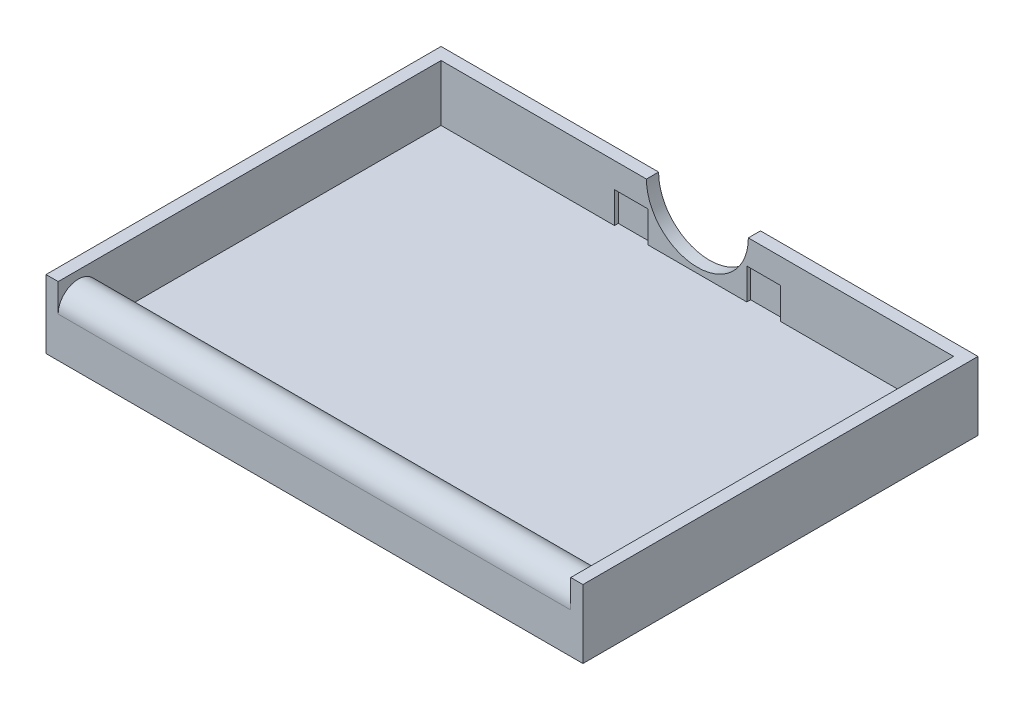
ISO-10303-21;
HEADER;
FILE_DESCRIPTION(('STEP AP214'),'2;1');
FILE_NAME('part.step','',(''),(''),'','','');
FILE_SCHEMA(('AUTOMOTIVE_DESIGN { 1 0 10303 214 1 1 1 1 }'));
ENDSEC;
DATA;
#1=APPLICATION_CONTEXT('core data for automotive mechanical design processes');
#2=APPLICATION_PROTOCOL_DEFINITION('international standard','automotive_design',2000,#1);
#3=PRODUCT_CONTEXT('',#1,'mechanical');
#4=PRODUCT('Part','Part','',(#3));
#5=PRODUCT_RELATED_PRODUCT_CATEGORY('part','',(#4));
#6=PRODUCT_DEFINITION_FORMATION('','',#4);
#7=PRODUCT_DEFINITION_CONTEXT('part definition',#1,'design');
#8=PRODUCT_DEFINITION('design','',#6,#7);
#9=PRODUCT_DEFINITION_SHAPE('','',#8);
#10=(LENGTH_UNIT() NAMED_UNIT(*) SI_UNIT(.MILLI.,.METRE.));
#11=(NAMED_UNIT(*) PLANE_ANGLE_UNIT() SI_UNIT($,.RADIAN.));
#12=(NAMED_UNIT(*) SI_UNIT($,.STERADIAN.) SOLID_ANGLE_UNIT());
#13=UNCERTAINTY_MEASURE_WITH_UNIT(LENGTH_MEASURE(1.E-05),#10,'distance_accuracy_value','');
#14=(GEOMETRIC_REPRESENTATION_CONTEXT(3) GLOBAL_UNCERTAINTY_ASSIGNED_CONTEXT((#13)) GLOBAL_UNIT_ASSIGNED_CONTEXT((#10,
#11,#12)) REPRESENTATION_CONTEXT('',''));
#15=CARTESIAN_POINT('',(0.,0.,0.));
#16=DIRECTION('',(0.,0.,1.));
#17=DIRECTION('',(1.,0.,0.));
#18=AXIS2_PLACEMENT_3D('',#15,#16,#17);
#19=CARTESIAN_POINT('',(69.2,4.5,49.1));
#20=DIRECTION('',(-1.,0.,0.));
#21=DIRECTION('',(0.,0.,1.));
#22=AXIS2_PLACEMENT_3D('',#19,#20,#21);
#23=CYLINDRICAL_SURFACE('',#22,2.65);
#24=DIRECTION('',(-1.,0.,0.));
#25=VECTOR('',#24,1.);
#26=CARTESIAN_POINT('',(0.,4.49999999999999,51.75));
#27=LINE('',#26,#25);
#28=CARTESIAN_POINT('',(68.9,4.5,51.75));
#29=VERTEX_POINT('',#28);
#30=CARTESIAN_POINT('',(1.50000000000001,4.49999999999999,51.75));
#31=VERTEX_POINT('',#30);
#32=EDGE_CURVE('E174',#29,#31,#27,.T.);
#33=ORIENTED_EDGE('',*,*,#32,.F.);
#34=CARTESIAN_POINT('',(68.9,4.5,49.1));
#35=DIRECTION('',(-1.,0.,0.));
#36=DIRECTION('',(0.,0.,1.));
#37=AXIS2_PLACEMENT_3D('',#34,#35,#36);
#38=CIRCLE('',#37,2.65);
#39=CARTESIAN_POINT('',(68.9,1.85,49.1));
#40=VERTEX_POINT('',#39);
#41=EDGE_CURVE('E52',#40,#29,#38,.F.);
#42=ORIENTED_EDGE('',*,*,#41,.F.);
#43=DIRECTION('',(-1.,0.,0.));
#44=VECTOR('',#43,1.);
#45=CARTESIAN_POINT('',(69.2,1.85,49.1));
#46=LINE('',#45,#44);
#47=CARTESIAN_POINT('',(1.50000000000001,1.85,49.1));
#48=VERTEX_POINT('',#47);
#49=EDGE_CURVE('E11',#40,#48,#46,.T.);
#50=ORIENTED_EDGE('',*,*,#49,.T.);
#51=CARTESIAN_POINT('',(1.50000000000001,4.5,49.1));
#52=DIRECTION('',(1.,0.,0.));
#53=DIRECTION('',(0.,0.,-1.));
#54=AXIS2_PLACEMENT_3D('',#51,#52,#53);
#55=CIRCLE('',#54,2.65);
#56=EDGE_CURVE('E172',#48,#31,#55,.T.);
#57=ORIENTED_EDGE('',*,*,#56,.T.);
#58=EDGE_LOOP('',(#33,#42,#50,#57));
#59=FACE_BOUND('',#58,.T.);
#60=ADVANCED_FACE('F37',(#59),#23,.T.);
#61=CARTESIAN_POINT('',(1.50000000000001,4.5,49.1));
#62=DIRECTION('',(0.,0.,1.));
#63=DIRECTION('',(1.,0.,0.));
#64=AXIS2_PLACEMENT_3D('',#61,#62,#63);
#65=PLANE('',#64);
#66=ORIENTED_EDGE('',*,*,#49,.F.);
#67=DIRECTION('',(0.,-1.,0.));
#68=VECTOR('',#67,1.);
#69=CARTESIAN_POINT('',(68.9,4.5,49.1));
#70=LINE('',#69,#68);
#71=CARTESIAN_POINT('',(68.9,0.8,49.1));
#72=VERTEX_POINT('',#71);
#73=EDGE_CURVE('E214',#40,#72,#70,.T.);
#74=ORIENTED_EDGE('',*,*,#73,.T.);
#75=DIRECTION('',(-1.,0.,0.));
#76=VECTOR('',#75,1.);
#77=CARTESIAN_POINT('',(1.50000000000001,0.8,49.1));
#78=LINE('',#77,#76);
#79=CARTESIAN_POINT('',(1.50000000000001,0.8,49.1));
#80=VERTEX_POINT('',#79);
#81=EDGE_CURVE('E209',#72,#80,#78,.T.);
#82=ORIENTED_EDGE('',*,*,#81,.T.);
#83=DIRECTION('',(0.,-1.,0.));
#84=VECTOR('',#83,1.);
#85=CARTESIAN_POINT('',(1.50000000000001,4.5,49.1));
#86=LINE('',#85,#84);
#87=EDGE_CURVE('E212',#48,#80,#86,.T.);
#88=ORIENTED_EDGE('',*,*,#87,.F.);
#89=EDGE_LOOP('',(#66,#74,#82,#88));
#90=FACE_BOUND('',#89,.T.);
#91=ADVANCED_FACE('F368',(#90),#65,.F.);
#92=CARTESIAN_POINT('',(0.,0.8,0.));
#93=DIRECTION('',(0.,-1.,0.));
#94=DIRECTION('',(0.,0.,-1.));
#95=AXIS2_PLACEMENT_3D('',#92,#93,#94);
#96=PLANE('',#95);
#97=ORIENTED_EDGE('',*,*,#81,.F.);
#98=DIRECTION('',(0.,0.,1.));
#99=VECTOR('',#98,1.);
#100=CARTESIAN_POINT('',(68.9,0.8,1.4));
#101=LINE('',#100,#99);
#102=CARTESIAN_POINT('',(68.9,0.8,1.4));
#103=VERTEX_POINT('',#102);
#104=EDGE_CURVE('E275',#103,#72,#101,.T.);
#105=ORIENTED_EDGE('',*,*,#104,.F.);
#106=DIRECTION('',(1.,0.,0.));
#107=VECTOR('',#106,1.);
#108=CARTESIAN_POINT('',(46.,0.8,1.4));
#109=LINE('',#108,#107);
#110=CARTESIAN_POINT('',(46.1,0.8,1.4));
#111=VERTEX_POINT('',#110);
#112=EDGE_CURVE('E305',#111,#103,#109,.T.);
#113=ORIENTED_EDGE('',*,*,#112,.F.);
#114=DIRECTION('',(0.,0.,1.));
#115=VECTOR('',#114,1.);
#116=CARTESIAN_POINT('',(46.1,0.8,0.9));
#117=LINE('',#116,#115);
#118=CARTESIAN_POINT('',(46.1,0.8,0.9));
#119=VERTEX_POINT('',#118);
#120=EDGE_CURVE('E231',#119,#111,#117,.T.);
#121=ORIENTED_EDGE('',*,*,#120,.F.);
#122=DIRECTION('',(1.,0.,0.));
#123=VECTOR('',#122,1.);
#124=CARTESIAN_POINT('',(41.9,0.8,0.9));
#125=LINE('',#124,#123);
#126=CARTESIAN_POINT('',(41.7,0.8,0.9));
#127=VERTEX_POINT('',#126);
#128=EDGE_CURVE('E292',#127,#119,#125,.T.);
#129=ORIENTED_EDGE('',*,*,#128,.F.);
#130=DIRECTION('',(0.,0.,-1.));
#131=VECTOR('',#130,1.);
#132=CARTESIAN_POINT('',(41.7,0.8,1.4));
#133=LINE('',#132,#131);
#134=CARTESIAN_POINT('',(41.7,0.8,1.4));
#135=VERTEX_POINT('',#134);
#136=EDGE_CURVE('E256',#135,#127,#133,.T.);
#137=ORIENTED_EDGE('',*,*,#136,.F.);
#138=DIRECTION('',(1.,0.,0.));
#139=VECTOR('',#138,1.);
#140=CARTESIAN_POINT('',(28.5,0.8,1.4));
#141=LINE('',#140,#139);
#142=CARTESIAN_POINT('',(28.7,0.8,1.4));
#143=VERTEX_POINT('',#142);
#144=EDGE_CURVE('E301',#143,#135,#141,.T.);
#145=ORIENTED_EDGE('',*,*,#144,.F.);
#146=DIRECTION('',(0.,0.,1.));
#147=VECTOR('',#146,1.);
#148=CARTESIAN_POINT('',(28.7,0.8,0.9));
#149=LINE('',#148,#147);
#150=CARTESIAN_POINT('',(28.7,0.8,0.9));
#151=VERTEX_POINT('',#150);
#152=EDGE_CURVE('E242',#151,#143,#149,.T.);
#153=ORIENTED_EDGE('',*,*,#152,.F.);
#154=DIRECTION('',(1.,0.,0.));
#155=VECTOR('',#154,1.);
#156=CARTESIAN_POINT('',(24.4,0.8,0.9));
#157=LINE('',#156,#155);
#158=CARTESIAN_POINT('',(24.3,0.8,0.9));
#159=VERTEX_POINT('',#158);
#160=EDGE_CURVE('E295',#159,#151,#157,.T.);
#161=ORIENTED_EDGE('',*,*,#160,.F.);
#162=DIRECTION('',(0.,0.,-1.));
#163=VECTOR('',#162,1.);
#164=CARTESIAN_POINT('',(24.3,0.8,1.4));
#165=LINE('',#164,#163);
#166=CARTESIAN_POINT('',(24.3,0.8,1.4));
#167=VERTEX_POINT('',#166);
#168=EDGE_CURVE('E222',#167,#159,#165,.T.);
#169=ORIENTED_EDGE('',*,*,#168,.F.);
#170=DIRECTION('',(1.,0.,0.));
#171=VECTOR('',#170,1.);
#172=CARTESIAN_POINT('',(1.6,0.8,1.4));
#173=LINE('',#172,#171);
#174=CARTESIAN_POINT('',(1.5,0.8,1.4));
#175=VERTEX_POINT('',#174);
#176=EDGE_CURVE('E313',#175,#167,#173,.T.);
#177=ORIENTED_EDGE('',*,*,#176,.F.);
#178=DIRECTION('',(0.,0.,-1.));
#179=VECTOR('',#178,1.);
#180=CARTESIAN_POINT('',(1.50000000000001,0.8,48.4));
#181=LINE('',#180,#179);
#182=EDGE_CURVE('E278',#80,#175,#181,.T.);
#183=ORIENTED_EDGE('',*,*,#182,.F.);
#184=EDGE_LOOP('',(#97,#105,#113,#121,#129,#137,#145,#153,#161,#169,#177,#183));
#185=FACE_BOUND('',#184,.T.);
#186=ADVANCED_FACE('F366',(#185),#96,.F.);
#187=CARTESIAN_POINT('',(1.50000000000001,4.9,48.4));
#188=DIRECTION('',(1.,0.,0.));
#189=DIRECTION('',(0.,0.,-1.));
#190=AXIS2_PLACEMENT_3D('',#187,#188,#189);
#191=PLANE('',#190);
#192=DIRECTION('',(0.,0.,1.));
#193=VECTOR('',#192,1.);
#194=CARTESIAN_POINT('',(1.5,8.2,1.4));
#195=LINE('',#194,#193);
#196=CARTESIAN_POINT('',(1.5,8.2,1.4));
#197=VERTEX_POINT('',#196);
#198=CARTESIAN_POINT('',(1.50000000000001,8.2,51.75));
#199=VERTEX_POINT('',#198);
#200=EDGE_CURVE('E192',#197,#199,#195,.T.);
#201=ORIENTED_EDGE('',*,*,#200,.T.);
#202=DIRECTION('',(0.,1.,0.));
#203=VECTOR('',#202,1.);
#204=CARTESIAN_POINT('',(1.50000000000001,0.,51.75));
#205=LINE('',#204,#203);
#206=EDGE_CURVE('E184',#31,#199,#205,.T.);
#207=ORIENTED_EDGE('',*,*,#206,.F.);
#208=ORIENTED_EDGE('',*,*,#56,.F.);
#209=ORIENTED_EDGE('',*,*,#87,.T.);
#210=ORIENTED_EDGE('',*,*,#182,.T.);
#211=DIRECTION('',(0.,1.,0.));
#212=VECTOR('',#211,1.);
#213=CARTESIAN_POINT('',(1.5,0.8,1.4));
#214=LINE('',#213,#212);
#215=EDGE_CURVE('E280',#175,#197,#214,.T.);
#216=ORIENTED_EDGE('',*,*,#215,.T.);
#217=EDGE_LOOP('',(#201,#207,#208,#209,#210,#216));
#218=FACE_BOUND('',#217,.T.);
#219=ADVANCED_FACE('F189',(#218),#191,.T.);
#220=CARTESIAN_POINT('',(68.9,4.9,48.4));
#221=DIRECTION('',(-1.,0.,0.));
#222=DIRECTION('',(0.,0.,1.));
#223=AXIS2_PLACEMENT_3D('',#220,#221,#222);
#224=PLANE('',#223);
#225=ORIENTED_EDGE('',*,*,#73,.F.);
#226=ORIENTED_EDGE('',*,*,#41,.T.);
#227=DIRECTION('',(0.,-1.,0.));
#228=VECTOR('',#227,1.);
#229=CARTESIAN_POINT('',(68.9,0.,51.75));
#230=LINE('',#229,#228);
#231=CARTESIAN_POINT('',(68.9,8.2,51.75));
#232=VERTEX_POINT('',#231);
#233=EDGE_CURVE('E187',#232,#29,#230,.T.);
#234=ORIENTED_EDGE('',*,*,#233,.F.);
#235=DIRECTION('',(0.,0.,-1.));
#236=VECTOR('',#235,1.);
#237=CARTESIAN_POINT('',(68.9,8.2,50.7));
#238=LINE('',#237,#236);
#239=CARTESIAN_POINT('',(68.9,8.2,1.4));
#240=VERTEX_POINT('',#239);
#241=EDGE_CURVE('E270',#232,#240,#238,.T.);
#242=ORIENTED_EDGE('',*,*,#241,.T.);
#243=DIRECTION('',(0.,-1.,0.));
#244=VECTOR('',#243,1.);
#245=CARTESIAN_POINT('',(68.9,8.2,1.4));
#246=LINE('',#245,#244);
#247=EDGE_CURVE('E272',#240,#103,#246,.T.);
#248=ORIENTED_EDGE('',*,*,#247,.T.);
#249=ORIENTED_EDGE('',*,*,#104,.T.);
#250=EDGE_LOOP('',(#225,#226,#234,#242,#248,#249));
#251=FACE_BOUND('',#250,.T.);
#252=ADVANCED_FACE('F355',(#251),#224,.T.);
#253=CARTESIAN_POINT('',(35.2,8.2,-5.));
#254=DIRECTION('',(0.,0.,1.));
#255=DIRECTION('',(1.,0.,0.));
#256=AXIS2_PLACEMENT_3D('',#253,#254,#255);
#257=CYLINDRICAL_SURFACE('',#256,6.7);
#258=CARTESIAN_POINT('',(35.2,8.2,1.4));
#259=DIRECTION('',(0.,0.,-1.));
#260=DIRECTION('',(1.,0.,0.));
#261=AXIS2_PLACEMENT_3D('',#258,#259,#260);
#262=CIRCLE('',#261,6.7);
#263=CARTESIAN_POINT('',(41.9,8.2,1.4));
#264=VERTEX_POINT('',#263);
#265=CARTESIAN_POINT('',(28.5,8.2,1.4));
#266=VERTEX_POINT('',#265);
#267=EDGE_CURVE('E309',#264,#266,#262,.T.);
#268=ORIENTED_EDGE('',*,*,#267,.F.);
#269=DIRECTION('',(0.,0.,1.));
#270=VECTOR('',#269,1.);
#271=CARTESIAN_POINT('',(41.9,8.2,-5.));
#272=LINE('',#271,#270);
#273=CARTESIAN_POINT('',(41.9,8.2,-0.2));
#274=VERTEX_POINT('',#273);
#275=EDGE_CURVE('E326',#264,#274,#272,.F.);
#276=ORIENTED_EDGE('',*,*,#275,.T.);
#277=CARTESIAN_POINT('',(35.2,8.2,-0.2));
#278=DIRECTION('',(0.,0.,1.));
#279=DIRECTION('',(-1.,0.,0.));
#280=AXIS2_PLACEMENT_3D('',#277,#278,#279);
#281=CIRCLE('',#280,6.7);
#282=CARTESIAN_POINT('',(28.5,8.2,-0.2));
#283=VERTEX_POINT('',#282);
#284=EDGE_CURVE('E319',#283,#274,#281,.T.);
#285=ORIENTED_EDGE('',*,*,#284,.F.);
#286=DIRECTION('',(0.,0.,1.));
#287=VECTOR('',#286,1.);
#288=CARTESIAN_POINT('',(28.5,8.2,-5.));
#289=LINE('',#288,#287);
#290=EDGE_CURVE('E45',#283,#266,#289,.T.);
#291=ORIENTED_EDGE('',*,*,#290,.T.);
#292=EDGE_LOOP('',(#268,#276,#285,#291));
#293=FACE_BOUND('',#292,.T.);
#294=ADVANCED_FACE('F331',(#293),#257,.F.);
#295=CARTESIAN_POINT('',(0.,4.9,1.1));
#296=DIRECTION('',(0.,1.,0.));
#297=DIRECTION('',(-1.,0.,0.));
#298=AXIS2_PLACEMENT_3D('',#295,#296,#297);
#299=PLANE('',#298);
#300=DIRECTION('',(1.,0.,0.));
#301=VECTOR('',#300,1.);
#302=CARTESIAN_POINT('',(24.4,4.9,1.4));
#303=LINE('',#302,#301);
#304=CARTESIAN_POINT('',(24.3,4.9,1.4));
#305=VERTEX_POINT('',#304);
#306=CARTESIAN_POINT('',(28.7,4.9,1.4));
#307=VERTEX_POINT('',#306);
#308=EDGE_CURVE('E297',#305,#307,#303,.T.);
#309=ORIENTED_EDGE('',*,*,#308,.F.);
#310=DIRECTION('',(0.,0.,1.));
#311=VECTOR('',#310,1.);
#312=CARTESIAN_POINT('',(24.3,4.9,0.9));
#313=LINE('',#312,#311);
#314=CARTESIAN_POINT('',(24.3,4.9,0.9));
#315=VERTEX_POINT('',#314);
#316=EDGE_CURVE('E216',#315,#305,#313,.T.);
#317=ORIENTED_EDGE('',*,*,#316,.F.);
#318=DIRECTION('',(-1.,0.,0.));
#319=VECTOR('',#318,1.);
#320=CARTESIAN_POINT('',(28.5,4.9,0.9));
#321=LINE('',#320,#319);
#322=CARTESIAN_POINT('',(28.7,4.9,0.9));
#323=VERTEX_POINT('',#322);
#324=EDGE_CURVE('E291',#323,#315,#321,.T.);
#325=ORIENTED_EDGE('',*,*,#324,.F.);
#326=DIRECTION('',(0.,0.,-1.));
#327=VECTOR('',#326,1.);
#328=CARTESIAN_POINT('',(28.7,4.9,1.4));
#329=LINE('',#328,#327);
#330=EDGE_CURVE('E247',#307,#323,#329,.T.);
#331=ORIENTED_EDGE('',*,*,#330,.F.);
#332=EDGE_LOOP('',(#309,#317,#325,#331));
#333=FACE_BOUND('',#332,.T.);
#334=ADVANCED_FACE('F377',(#333),#299,.F.);
#335=CARTESIAN_POINT('',(0.,4.9,1.1));
#336=DIRECTION('',(0.,-1.,0.));
#337=DIRECTION('',(0.,0.,-1.));
#338=AXIS2_PLACEMENT_3D('',#335,#336,#337);
#339=PLANE('',#338);
#340=DIRECTION('',(-1.,0.,0.));
#341=VECTOR('',#340,1.);
#342=CARTESIAN_POINT('',(46.,4.9,0.9));
#343=LINE('',#342,#341);
#344=CARTESIAN_POINT('',(46.1,4.9,0.9));
#345=VERTEX_POINT('',#344);
#346=CARTESIAN_POINT('',(41.7,4.9,0.9));
#347=VERTEX_POINT('',#346);
#348=EDGE_CURVE('E294',#345,#347,#343,.T.);
#349=ORIENTED_EDGE('',*,*,#348,.F.);
#350=DIRECTION('',(0.,0.,-1.));
#351=VECTOR('',#350,1.);
#352=CARTESIAN_POINT('',(46.1,4.9,1.4));
#353=LINE('',#352,#351);
#354=CARTESIAN_POINT('',(46.1,4.9,1.4));
#355=VERTEX_POINT('',#354);
#356=EDGE_CURVE('E236',#355,#345,#353,.T.);
#357=ORIENTED_EDGE('',*,*,#356,.F.);
#358=DIRECTION('',(1.,0.,0.));
#359=VECTOR('',#358,1.);
#360=CARTESIAN_POINT('',(41.9,4.9,1.4));
#361=LINE('',#360,#359);
#362=CARTESIAN_POINT('',(41.7,4.9,1.4));
#363=VERTEX_POINT('',#362);
#364=EDGE_CURVE('E303',#363,#355,#361,.T.);
#365=ORIENTED_EDGE('',*,*,#364,.F.);
#366=DIRECTION('',(0.,0.,1.));
#367=VECTOR('',#366,1.);
#368=CARTESIAN_POINT('',(41.7,4.9,0.9));
#369=LINE('',#368,#367);
#370=EDGE_CURVE('E250',#347,#363,#369,.T.);
#371=ORIENTED_EDGE('',*,*,#370,.F.);
#372=EDGE_LOOP('',(#349,#357,#365,#371));
#373=FACE_BOUND('',#372,.T.);
#374=ADVANCED_FACE('F394',(#373),#339,.T.);
#375=CARTESIAN_POINT('',(0.,8.2,0.));
#376=DIRECTION('',(0.,1.,0.));
#377=DIRECTION('',(0.,0.,1.));
#378=AXIS2_PLACEMENT_3D('',#375,#376,#377);
#379=PLANE('',#378);
#380=ORIENTED_EDGE('',*,*,#200,.F.);
#381=DIRECTION('',(-1.,0.,0.));
#382=VECTOR('',#381,1.);
#383=CARTESIAN_POINT('',(28.5,8.2,1.4));
#384=LINE('',#383,#382);
#385=EDGE_CURVE('E311',#266,#197,#384,.T.);
#386=ORIENTED_EDGE('',*,*,#385,.F.);
#387=ORIENTED_EDGE('',*,*,#290,.F.);
#388=DIRECTION('',(1.,0.,0.));
#389=VECTOR('',#388,1.);
#390=CARTESIAN_POINT('',(0.,8.2,-0.2));
#391=LINE('',#390,#389);
#392=CARTESIAN_POINT('',(-0.1,8.2,-0.2));
#393=VERTEX_POINT('',#392);
#394=EDGE_CURVE('E316',#393,#283,#391,.T.);
#395=ORIENTED_EDGE('',*,*,#394,.F.);
#396=DIRECTION('',(0.,0.,-1.));
#397=VECTOR('',#396,1.);
#398=CARTESIAN_POINT('',(-0.0999999999999938,8.2,50.7));
#399=LINE('',#398,#397);
#400=CARTESIAN_POINT('',(-0.0999999999999938,8.2,51.75));
#401=VERTEX_POINT('',#400);
#402=EDGE_CURVE('E283',#401,#393,#399,.T.);
#403=ORIENTED_EDGE('',*,*,#402,.F.);
#404=DIRECTION('',(-1.,0.,0.));
#405=VECTOR('',#404,1.);
#406=CARTESIAN_POINT('',(0.,8.2,51.75));
#407=LINE('',#406,#405);
#408=EDGE_CURVE('E193',#199,#401,#407,.T.);
#409=ORIENTED_EDGE('',*,*,#408,.F.);
#410=EDGE_LOOP('',(#380,#386,#387,#395,#403,#409));
#411=FACE_BOUND('',#410,.T.);
#412=ADVANCED_FACE('F335',(#411),#379,.T.);
#413=DIRECTION('',(-1.,0.,0.));
#414=VECTOR('',#413,1.);
#415=CARTESIAN_POINT('',(68.8,8.2,1.4));
#416=LINE('',#415,#414);
#417=EDGE_CURVE('E307',#240,#264,#416,.T.);
#418=ORIENTED_EDGE('',*,*,#417,.F.);
#419=ORIENTED_EDGE('',*,*,#241,.F.);
#420=DIRECTION('',(-1.,0.,0.));
#421=VECTOR('',#420,1.);
#422=CARTESIAN_POINT('',(0.,8.2,51.75));
#423=LINE('',#422,#421);
#424=CARTESIAN_POINT('',(70.5,8.2,51.75));
#425=VERTEX_POINT('',#424);
#426=EDGE_CURVE('E178',#425,#232,#423,.T.);
#427=ORIENTED_EDGE('',*,*,#426,.F.);
#428=DIRECTION('',(0.,0.,1.));
#429=VECTOR('',#428,1.);
#430=CARTESIAN_POINT('',(70.5,8.2,-0.2));
#431=LINE('',#430,#429);
#432=CARTESIAN_POINT('',(70.5,8.2,-0.2));
#433=VERTEX_POINT('',#432);
#434=EDGE_CURVE('E262',#433,#425,#431,.T.);
#435=ORIENTED_EDGE('',*,*,#434,.F.);
#436=DIRECTION('',(1.,0.,0.));
#437=VECTOR('',#436,1.);
#438=CARTESIAN_POINT('',(41.9,8.2,-0.2));
#439=LINE('',#438,#437);
#440=EDGE_CURVE('E322',#274,#433,#439,.T.);
#441=ORIENTED_EDGE('',*,*,#440,.F.);
#442=ORIENTED_EDGE('',*,*,#275,.F.);
#443=EDGE_LOOP('',(#418,#419,#427,#435,#441,#442));
#444=FACE_BOUND('',#443,.T.);
#445=ADVANCED_FACE('F39',(#444),#379,.T.);
#446=CARTESIAN_POINT('',(0.,-0.8,0.));
#447=DIRECTION('',(0.,-1.,0.));
#448=DIRECTION('',(0.,0.,-1.));
#449=AXIS2_PLACEMENT_3D('',#446,#447,#448);
#450=PLANE('',#449);
#451=DIRECTION('',(0.,0.,-1.));
#452=VECTOR('',#451,1.);
#453=CARTESIAN_POINT('',(70.5,-0.8,50.7));
#454=LINE('',#453,#452);
#455=CARTESIAN_POINT('',(70.5,-0.8,51.75));
#456=VERTEX_POINT('',#455);
#457=CARTESIAN_POINT('',(70.5,-0.8,-0.2));
#458=VERTEX_POINT('',#457);
#459=EDGE_CURVE('E264',#456,#458,#454,.T.);
#460=ORIENTED_EDGE('',*,*,#459,.F.);
#461=DIRECTION('',(1.,0.,0.));
#462=VECTOR('',#461,1.);
#463=CARTESIAN_POINT('',(0.,-0.8,51.75));
#464=LINE('',#463,#462);
#465=CARTESIAN_POINT('',(-0.099999999999989,-0.8,51.75));
#466=VERTEX_POINT('',#465);
#467=EDGE_CURVE('E201',#466,#456,#464,.T.);
#468=ORIENTED_EDGE('',*,*,#467,.F.);
#469=DIRECTION('',(0.,0.,1.));
#470=VECTOR('',#469,1.);
#471=CARTESIAN_POINT('',(-0.1,-0.8,-0.2));
#472=LINE('',#471,#470);
#473=CARTESIAN_POINT('',(-0.1,-0.8,-0.2));
#474=VERTEX_POINT('',#473);
#475=EDGE_CURVE('E289',#474,#466,#472,.T.);
#476=ORIENTED_EDGE('',*,*,#475,.F.);
#477=DIRECTION('',(-1.,0.,0.));
#478=VECTOR('',#477,1.);
#479=CARTESIAN_POINT('',(70.4,-0.8,-0.2));
#480=LINE('',#479,#478);
#481=EDGE_CURVE('E324',#458,#474,#480,.T.);
#482=ORIENTED_EDGE('',*,*,#481,.F.);
#483=EDGE_LOOP('',(#460,#468,#476,#482));
#484=FACE_BOUND('',#483,.T.);
#485=ADVANCED_FACE('F347',(#484),#450,.T.);
#486=CARTESIAN_POINT('',(35.2,8.2,-0.2));
#487=DIRECTION('',(0.,0.,-1.));
#488=DIRECTION('',(-1.,0.,0.));
#489=AXIS2_PLACEMENT_3D('',#486,#487,#488);
#490=PLANE('',#489);
#491=ORIENTED_EDGE('',*,*,#481,.T.);
#492=DIRECTION('',(0.,-1.,0.));
#493=VECTOR('',#492,1.);
#494=CARTESIAN_POINT('',(-0.1,8.2,-0.2));
#495=LINE('',#494,#493);
#496=EDGE_CURVE('E286',#393,#474,#495,.T.);
#497=ORIENTED_EDGE('',*,*,#496,.F.);
#498=ORIENTED_EDGE('',*,*,#394,.T.);
#499=ORIENTED_EDGE('',*,*,#284,.T.);
#500=ORIENTED_EDGE('',*,*,#440,.T.);
#501=DIRECTION('',(0.,1.,0.));
#502=VECTOR('',#501,1.);
#503=CARTESIAN_POINT('',(70.5,-0.8,-0.2));
#504=LINE('',#503,#502);
#505=EDGE_CURVE('E267',#458,#433,#504,.T.);
#506=ORIENTED_EDGE('',*,*,#505,.F.);
#507=EDGE_LOOP('',(#491,#497,#498,#499,#500,#506));
#508=FACE_BOUND('',#507,.T.);
#509=ADVANCED_FACE('F338',(#508),#490,.T.);
#510=CARTESIAN_POINT('',(35.2,8.2,1.4));
#511=DIRECTION('',(0.,0.,1.));
#512=DIRECTION('',(1.,0.,0.));
#513=AXIS2_PLACEMENT_3D('',#510,#511,#512);
#514=PLANE('',#513);
#515=DIRECTION('',(0.,-1.,0.));
#516=VECTOR('',#515,1.);
#517=CARTESIAN_POINT('',(24.3,4.9,1.4));
#518=LINE('',#517,#516);
#519=EDGE_CURVE('E219',#305,#167,#518,.T.);
#520=ORIENTED_EDGE('',*,*,#519,.F.);
#521=ORIENTED_EDGE('',*,*,#308,.T.);
#522=DIRECTION('',(0.,1.,0.));
#523=VECTOR('',#522,1.);
#524=CARTESIAN_POINT('',(28.7,0.8,1.4));
#525=LINE('',#524,#523);
#526=EDGE_CURVE('E244',#143,#307,#525,.T.);
#527=ORIENTED_EDGE('',*,*,#526,.F.);
#528=ORIENTED_EDGE('',*,*,#144,.T.);
#529=DIRECTION('',(0.,-1.,0.));
#530=VECTOR('',#529,1.);
#531=CARTESIAN_POINT('',(41.7,4.9,1.4));
#532=LINE('',#531,#530);
#533=EDGE_CURVE('E253',#363,#135,#532,.T.);
#534=ORIENTED_EDGE('',*,*,#533,.F.);
#535=ORIENTED_EDGE('',*,*,#364,.T.);
#536=DIRECTION('',(0.,1.,0.));
#537=VECTOR('',#536,1.);
#538=CARTESIAN_POINT('',(46.1,0.8,1.4));
#539=LINE('',#538,#537);
#540=EDGE_CURVE('E233',#111,#355,#539,.T.);
#541=ORIENTED_EDGE('',*,*,#540,.F.);
#542=ORIENTED_EDGE('',*,*,#112,.T.);
#543=ORIENTED_EDGE('',*,*,#247,.F.);
#544=ORIENTED_EDGE('',*,*,#417,.T.);
#545=ORIENTED_EDGE('',*,*,#267,.T.);
#546=ORIENTED_EDGE('',*,*,#385,.T.);
#547=ORIENTED_EDGE('',*,*,#215,.F.);
#548=ORIENTED_EDGE('',*,*,#176,.T.);
#549=EDGE_LOOP('',(#520,#521,#527,#528,#534,#535,#541,#542,#543,#544,#545,#546,#547,#548));
#550=FACE_BOUND('',#549,.T.);
#551=ADVANCED_FACE('F359',(#550),#514,.T.);
#552=CARTESIAN_POINT('',(0.,0.,0.9));
#553=DIRECTION('',(0.,0.,1.));
#554=DIRECTION('',(1.,0.,0.));
#555=AXIS2_PLACEMENT_3D('',#552,#553,#554);
#556=PLANE('',#555);
#557=ORIENTED_EDGE('',*,*,#160,.T.);
#558=DIRECTION('',(0.,-1.,0.));
#559=VECTOR('',#558,1.);
#560=CARTESIAN_POINT('',(28.7,4.9,0.9));
#561=LINE('',#560,#559);
#562=EDGE_CURVE('E239',#323,#151,#561,.T.);
#563=ORIENTED_EDGE('',*,*,#562,.F.);
#564=ORIENTED_EDGE('',*,*,#324,.T.);
#565=DIRECTION('',(0.,1.,0.));
#566=VECTOR('',#565,1.);
#567=CARTESIAN_POINT('',(24.3,0.8,0.9));
#568=LINE('',#567,#566);
#569=EDGE_CURVE('E225',#159,#315,#568,.T.);
#570=ORIENTED_EDGE('',*,*,#569,.F.);
#571=EDGE_LOOP('',(#557,#563,#564,#570));
#572=FACE_BOUND('',#571,.T.);
#573=ADVANCED_FACE('F399',(#572),#556,.T.);
#574=CARTESIAN_POINT('',(0.,0.,0.9));
#575=DIRECTION('',(0.,0.,1.));
#576=DIRECTION('',(1.,0.,0.));
#577=AXIS2_PLACEMENT_3D('',#574,#575,#576);
#578=PLANE('',#577);
#579=ORIENTED_EDGE('',*,*,#128,.T.);
#580=DIRECTION('',(0.,-1.,0.));
#581=VECTOR('',#580,1.);
#582=CARTESIAN_POINT('',(46.1,4.9,0.9));
#583=LINE('',#582,#581);
#584=EDGE_CURVE('E228',#345,#119,#583,.T.);
#585=ORIENTED_EDGE('',*,*,#584,.F.);
#586=ORIENTED_EDGE('',*,*,#348,.T.);
#587=DIRECTION('',(0.,1.,0.));
#588=VECTOR('',#587,1.);
#589=CARTESIAN_POINT('',(41.7,0.8,0.9));
#590=LINE('',#589,#588);
#591=EDGE_CURVE('E259',#127,#347,#590,.T.);
#592=ORIENTED_EDGE('',*,*,#591,.F.);
#593=EDGE_LOOP('',(#579,#585,#586,#592));
#594=FACE_BOUND('',#593,.T.);
#595=ADVANCED_FACE('F397',(#594),#578,.T.);
#596=CARTESIAN_POINT('',(-0.1,0.,0.));
#597=DIRECTION('',(-1.,0.,0.));
#598=DIRECTION('',(0.,0.,1.));
#599=AXIS2_PLACEMENT_3D('',#596,#597,#598);
#600=PLANE('',#599);
#601=ORIENTED_EDGE('',*,*,#475,.T.);
#602=DIRECTION('',(0.,-1.,0.));
#603=VECTOR('',#602,1.);
#604=CARTESIAN_POINT('',(-0.0999999999999938,0.,51.75));
#605=LINE('',#604,#603);
#606=EDGE_CURVE('E195',#401,#466,#605,.T.);
#607=ORIENTED_EDGE('',*,*,#606,.F.);
#608=ORIENTED_EDGE('',*,*,#402,.T.);
#609=ORIENTED_EDGE('',*,*,#496,.T.);
#610=EDGE_LOOP('',(#601,#607,#608,#609));
#611=FACE_BOUND('',#610,.T.);
#612=ADVANCED_FACE('F343',(#611),#600,.T.);
#613=CARTESIAN_POINT('',(70.5,0.,0.));
#614=DIRECTION('',(1.,0.,0.));
#615=DIRECTION('',(0.,0.,-1.));
#616=AXIS2_PLACEMENT_3D('',#613,#614,#615);
#617=PLANE('',#616);
#618=ORIENTED_EDGE('',*,*,#434,.T.);
#619=DIRECTION('',(0.,1.,0.));
#620=VECTOR('',#619,1.);
#621=CARTESIAN_POINT('',(70.5,0.,51.75));
#622=LINE('',#621,#620);
#623=EDGE_CURVE('E204',#456,#425,#622,.T.);
#624=ORIENTED_EDGE('',*,*,#623,.F.);
#625=ORIENTED_EDGE('',*,*,#459,.T.);
#626=ORIENTED_EDGE('',*,*,#505,.T.);
#627=EDGE_LOOP('',(#618,#624,#625,#626));
#628=FACE_BOUND('',#627,.T.);
#629=ADVANCED_FACE('F351',(#628),#617,.T.);
#630=CARTESIAN_POINT('',(41.7,0.,0.));
#631=DIRECTION('',(1.,0.,0.));
#632=DIRECTION('',(0.,0.,-1.));
#633=AXIS2_PLACEMENT_3D('',#630,#631,#632);
#634=PLANE('',#633);
#635=ORIENTED_EDGE('',*,*,#370,.T.);
#636=ORIENTED_EDGE('',*,*,#533,.T.);
#637=ORIENTED_EDGE('',*,*,#136,.T.);
#638=ORIENTED_EDGE('',*,*,#591,.T.);
#639=EDGE_LOOP('',(#635,#636,#637,#638));
#640=FACE_BOUND('',#639,.T.);
#641=ADVANCED_FACE('F388',(#640),#634,.T.);
#642=CARTESIAN_POINT('',(28.7,0.,0.));
#643=DIRECTION('',(-1.,0.,0.));
#644=DIRECTION('',(0.,0.,1.));
#645=AXIS2_PLACEMENT_3D('',#642,#643,#644);
#646=PLANE('',#645);
#647=ORIENTED_EDGE('',*,*,#562,.T.);
#648=ORIENTED_EDGE('',*,*,#152,.T.);
#649=ORIENTED_EDGE('',*,*,#526,.T.);
#650=ORIENTED_EDGE('',*,*,#330,.T.);
#651=EDGE_LOOP('',(#647,#648,#649,#650));
#652=FACE_BOUND('',#651,.T.);
#653=ADVANCED_FACE('F381',(#652),#646,.T.);
#654=CARTESIAN_POINT('',(46.1,0.,0.));
#655=DIRECTION('',(-1.,0.,0.));
#656=DIRECTION('',(0.,0.,1.));
#657=AXIS2_PLACEMENT_3D('',#654,#655,#656);
#658=PLANE('',#657);
#659=ORIENTED_EDGE('',*,*,#584,.T.);
#660=ORIENTED_EDGE('',*,*,#120,.T.);
#661=ORIENTED_EDGE('',*,*,#540,.T.);
#662=ORIENTED_EDGE('',*,*,#356,.T.);
#663=EDGE_LOOP('',(#659,#660,#661,#662));
#664=FACE_BOUND('',#663,.T.);
#665=ADVANCED_FACE('F393',(#664),#658,.T.);
#666=CARTESIAN_POINT('',(24.3,0.,0.));
#667=DIRECTION('',(1.,0.,0.));
#668=DIRECTION('',(0.,0.,-1.));
#669=AXIS2_PLACEMENT_3D('',#666,#667,#668);
#670=PLANE('',#669);
#671=ORIENTED_EDGE('',*,*,#316,.T.);
#672=ORIENTED_EDGE('',*,*,#519,.T.);
#673=ORIENTED_EDGE('',*,*,#168,.T.);
#674=ORIENTED_EDGE('',*,*,#569,.T.);
#675=EDGE_LOOP('',(#671,#672,#673,#674));
#676=FACE_BOUND('',#675,.T.);
#677=ADVANCED_FACE('F373',(#676),#670,.T.);
#678=CARTESIAN_POINT('',(0.,0.,51.75));
#679=DIRECTION('',(0.,0.,1.));
#680=DIRECTION('',(1.,0.,0.));
#681=AXIS2_PLACEMENT_3D('',#678,#679,#680);
#682=PLANE('',#681);
#683=ORIENTED_EDGE('',*,*,#233,.T.);
#684=ORIENTED_EDGE('',*,*,#32,.T.);
#685=ORIENTED_EDGE('',*,*,#206,.T.);
#686=ORIENTED_EDGE('',*,*,#408,.T.);
#687=ORIENTED_EDGE('',*,*,#606,.T.);
#688=ORIENTED_EDGE('',*,*,#467,.T.);
#689=ORIENTED_EDGE('',*,*,#623,.T.);
#690=ORIENTED_EDGE('',*,*,#426,.T.);
#691=EDGE_LOOP('',(#683,#684,#685,#686,#687,#688,#689,#690));
#692=FACE_BOUND('',#691,.T.);
#693=ADVANCED_FACE('F182',(#692),#682,.T.);
#694=CLOSED_SHELL('',(#60,#91,#186,#219,#252,#294,#334,#374,#412,#445,#485,#509,#551,#573,#595,
#612,#629,#641,#653,#665,#677,#693));
#695=MANIFOLD_SOLID_BREP('B2',#694);
#696=ADVANCED_BREP_SHAPE_REPRESENTATION('',(#18,#695),#14);
#697=SHAPE_DEFINITION_REPRESENTATION(#9,#696);
ENDSEC;
END-ISO-10303-21;
